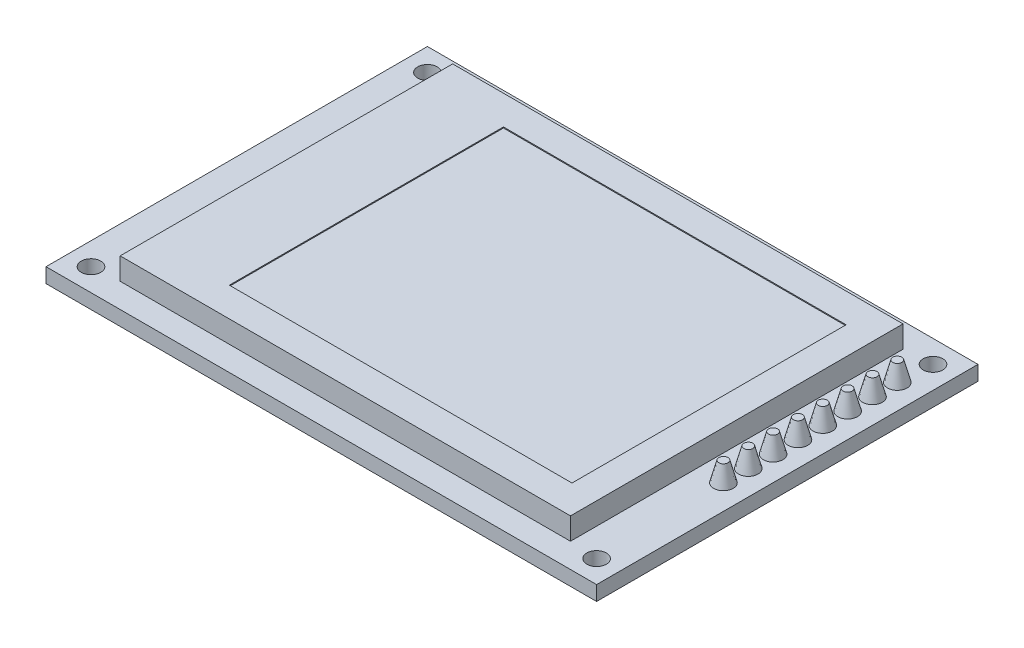
ISO-10303-21;
HEADER;
FILE_DESCRIPTION(('STEP AP214'),'2;1');
FILE_NAME('part.step','',(''),(''),'','','');
FILE_SCHEMA(('AUTOMOTIVE_DESIGN { 1 0 10303 214 1 1 1 1 }'));
ENDSEC;
DATA;
#1=APPLICATION_CONTEXT('core data for automotive mechanical design processes');
#2=APPLICATION_PROTOCOL_DEFINITION('international standard','automotive_design',2000,#1);
#3=PRODUCT_CONTEXT('',#1,'mechanical');
#4=PRODUCT('Part','Part','',(#3));
#5=PRODUCT_RELATED_PRODUCT_CATEGORY('part','',(#4));
#6=PRODUCT_DEFINITION_FORMATION('','',#4);
#7=PRODUCT_DEFINITION_CONTEXT('part definition',#1,'design');
#8=PRODUCT_DEFINITION('design','',#6,#7);
#9=PRODUCT_DEFINITION_SHAPE('','',#8);
#10=(LENGTH_UNIT() NAMED_UNIT(*) SI_UNIT(.MILLI.,.METRE.));
#11=(NAMED_UNIT(*) PLANE_ANGLE_UNIT() SI_UNIT($,.RADIAN.));
#12=(NAMED_UNIT(*) SI_UNIT($,.STERADIAN.) SOLID_ANGLE_UNIT());
#13=UNCERTAINTY_MEASURE_WITH_UNIT(LENGTH_MEASURE(1.E-05),#10,'distance_accuracy_value','');
#14=(GEOMETRIC_REPRESENTATION_CONTEXT(3) GLOBAL_UNCERTAINTY_ASSIGNED_CONTEXT((#13)) GLOBAL_UNIT_ASSIGNED_CONTEXT((#10,
#11,#12)) REPRESENTATION_CONTEXT('',''));
#15=CARTESIAN_POINT('',(0.,0.,0.));
#16=DIRECTION('',(0.,0.,1.));
#17=DIRECTION('',(1.,0.,0.));
#18=AXIS2_PLACEMENT_3D('',#15,#16,#17);
#19=CARTESIAN_POINT('',(0.,1.5,0.));
#20=DIRECTION('',(0.,1.,0.));
#21=DIRECTION('',(0.,0.,1.));
#22=AXIS2_PLACEMENT_3D('',#19,#20,#21);
#23=PLANE('',#22);
#24=CARTESIAN_POINT('',(22.9900000000002,1.5,5.51999999999999));
#25=DIRECTION('',(0.,1.,0.));
#26=DIRECTION('',(0.,0.,1.));
#27=AXIS2_PLACEMENT_3D('',#24,#25,#26);
#28=CIRCLE('',#27,1.);
#29=CARTESIAN_POINT('',(22.9900000000002,1.5,6.52));
#30=VERTEX_POINT('',#29);
#31=EDGE_CURVE('E416',#30,#30,#28,.T.);
#32=ORIENTED_EDGE('',*,*,#31,.F.);
#33=EDGE_LOOP('',(#32));
#34=FACE_BOUND('',#33,.T.);
#35=CARTESIAN_POINT('',(22.9900000000002,1.5,2.97999999999999));
#36=DIRECTION('',(0.,1.,0.));
#37=DIRECTION('',(0.,0.,1.));
#38=AXIS2_PLACEMENT_3D('',#35,#36,#37);
#39=CIRCLE('',#38,1.);
#40=CARTESIAN_POINT('',(22.9900000000002,1.5,3.97999999999999));
#41=VERTEX_POINT('',#40);
#42=EDGE_CURVE('E415',#41,#41,#39,.T.);
#43=ORIENTED_EDGE('',*,*,#42,.F.);
#44=EDGE_LOOP('',(#43));
#45=FACE_BOUND('',#44,.T.);
#46=CARTESIAN_POINT('',(22.9900000000001,1.5,0.439999999999994));
#47=DIRECTION('',(0.,1.,0.));
#48=DIRECTION('',(0.,0.,1.));
#49=AXIS2_PLACEMENT_3D('',#46,#47,#48);
#50=CIRCLE('',#49,1.);
#51=CARTESIAN_POINT('',(22.9900000000001,1.5,1.44));
#52=VERTEX_POINT('',#51);
#53=EDGE_CURVE('E426',#52,#52,#50,.T.);
#54=ORIENTED_EDGE('',*,*,#53,.F.);
#55=EDGE_LOOP('',(#54));
#56=FACE_BOUND('',#55,.T.);
#57=CARTESIAN_POINT('',(22.9900000000001,1.5,-2.10000000000001));
#58=DIRECTION('',(0.,1.,0.));
#59=DIRECTION('',(0.,0.,1.));
#60=AXIS2_PLACEMENT_3D('',#57,#58,#59);
#61=CIRCLE('',#60,1.);
#62=CARTESIAN_POINT('',(22.9900000000001,1.5,-1.1));
#63=VERTEX_POINT('',#62);
#64=EDGE_CURVE('E432',#63,#63,#61,.T.);
#65=ORIENTED_EDGE('',*,*,#64,.F.);
#66=EDGE_LOOP('',(#65));
#67=FACE_BOUND('',#66,.T.);
#68=CARTESIAN_POINT('',(22.9900000000001,1.5,-4.64000000000001));
#69=DIRECTION('',(0.,1.,0.));
#70=DIRECTION('',(0.,0.,1.));
#71=AXIS2_PLACEMENT_3D('',#68,#69,#70);
#72=CIRCLE('',#71,1.);
#73=CARTESIAN_POINT('',(22.9900000000001,1.5,-3.64000000000001));
#74=VERTEX_POINT('',#73);
#75=EDGE_CURVE('E438',#74,#74,#72,.T.);
#76=ORIENTED_EDGE('',*,*,#75,.F.);
#77=EDGE_LOOP('',(#76));
#78=FACE_BOUND('',#77,.T.);
#79=CARTESIAN_POINT('',(22.99,1.5,-7.18000000000001));
#80=DIRECTION('',(0.,1.,0.));
#81=DIRECTION('',(0.,0.,1.));
#82=AXIS2_PLACEMENT_3D('',#79,#80,#81);
#83=CIRCLE('',#82,1.);
#84=CARTESIAN_POINT('',(22.99,1.5,-6.18000000000001));
#85=VERTEX_POINT('',#84);
#86=EDGE_CURVE('E444',#85,#85,#83,.T.);
#87=ORIENTED_EDGE('',*,*,#86,.F.);
#88=EDGE_LOOP('',(#87));
#89=FACE_BOUND('',#88,.T.);
#90=CARTESIAN_POINT('',(22.99,1.5,-9.72000000000001));
#91=DIRECTION('',(0.,1.,0.));
#92=DIRECTION('',(0.,0.,1.));
#93=AXIS2_PLACEMENT_3D('',#90,#91,#92);
#94=CIRCLE('',#93,1.);
#95=CARTESIAN_POINT('',(22.99,1.5,-8.72000000000001));
#96=VERTEX_POINT('',#95);
#97=EDGE_CURVE('E450',#96,#96,#94,.T.);
#98=ORIENTED_EDGE('',*,*,#97,.F.);
#99=EDGE_LOOP('',(#98));
#100=FACE_BOUND('',#99,.T.);
#101=CARTESIAN_POINT('',(22.99,1.5,-12.26));
#102=DIRECTION('',(0.,1.,0.));
#103=DIRECTION('',(0.,0.,1.));
#104=AXIS2_PLACEMENT_3D('',#101,#102,#103);
#105=CIRCLE('',#104,1.);
#106=CARTESIAN_POINT('',(22.99,1.5,-11.26));
#107=VERTEX_POINT('',#106);
#108=EDGE_CURVE('E455',#107,#107,#105,.T.);
#109=ORIENTED_EDGE('',*,*,#108,.F.);
#110=EDGE_LOOP('',(#109));
#111=FACE_BOUND('',#110,.T.);
#112=CARTESIAN_POINT('',(-28.48,1.5,18.72));
#113=DIRECTION('',(0.,1.,0.));
#114=DIRECTION('',(0.,0.,1.));
#115=AXIS2_PLACEMENT_3D('',#112,#113,#114);
#116=CIRCLE('',#115,0.999999999999998);
#117=CARTESIAN_POINT('',(-28.48,1.5,19.72));
#118=VERTEX_POINT('',#117);
#119=EDGE_CURVE('E201',#118,#118,#116,.T.);
#120=ORIENTED_EDGE('',*,*,#119,.F.);
#121=EDGE_LOOP('',(#120));
#122=FACE_BOUND('',#121,.T.);
#123=CARTESIAN_POINT('',(-28.48,1.5,-15.68));
#124=DIRECTION('',(0.,1.,0.));
#125=DIRECTION('',(0.,0.,1.));
#126=AXIS2_PLACEMENT_3D('',#123,#124,#125);
#127=CIRCLE('',#126,0.999999999999998);
#128=CARTESIAN_POINT('',(-28.48,1.5,-14.68));
#129=VERTEX_POINT('',#128);
#130=EDGE_CURVE('E213',#129,#129,#127,.T.);
#131=ORIENTED_EDGE('',*,*,#130,.F.);
#132=EDGE_LOOP('',(#131));
#133=FACE_BOUND('',#132,.T.);
#134=DIRECTION('',(0.,0.,1.));
#135=VECTOR('',#134,1.);
#136=CARTESIAN_POINT('',(-30.78,1.5,-17.98));
#137=LINE('',#136,#135);
#138=CARTESIAN_POINT('',(-30.78,1.5,-17.98));
#139=VERTEX_POINT('',#138);
#140=CARTESIAN_POINT('',(-30.78,1.5,21.02));
#141=VERTEX_POINT('',#140);
#142=EDGE_CURVE('E219',#139,#141,#137,.T.);
#143=ORIENTED_EDGE('',*,*,#142,.T.);
#144=DIRECTION('',(1.,0.,0.));
#145=VECTOR('',#144,1.);
#146=CARTESIAN_POINT('',(-30.78,1.5,21.02));
#147=LINE('',#146,#145);
#148=CARTESIAN_POINT('',(25.52,1.5,21.02));
#149=VERTEX_POINT('',#148);
#150=EDGE_CURVE('E222',#141,#149,#147,.T.);
#151=ORIENTED_EDGE('',*,*,#150,.T.);
#152=DIRECTION('',(0.,0.,-1.));
#153=VECTOR('',#152,1.);
#154=CARTESIAN_POINT('',(25.52,1.5,-17.98));
#155=LINE('',#154,#153);
#156=CARTESIAN_POINT('',(25.52,1.5,-17.98));
#157=VERTEX_POINT('',#156);
#158=EDGE_CURVE('E225',#149,#157,#155,.T.);
#159=ORIENTED_EDGE('',*,*,#158,.T.);
#160=DIRECTION('',(-1.,0.,0.));
#161=VECTOR('',#160,1.);
#162=CARTESIAN_POINT('',(-30.78,1.5,-17.98));
#163=LINE('',#162,#161);
#164=EDGE_CURVE('E227',#157,#139,#163,.T.);
#165=ORIENTED_EDGE('',*,*,#164,.T.);
#166=EDGE_LOOP('',(#143,#151,#159,#165));
#167=FACE_BOUND('',#166,.T.);
#168=CARTESIAN_POINT('',(23.22,1.5,-15.68));
#169=DIRECTION('',(0.,1.,0.));
#170=DIRECTION('',(0.,0.,1.));
#171=AXIS2_PLACEMENT_3D('',#168,#169,#170);
#172=CIRCLE('',#171,0.999999999999998);
#173=CARTESIAN_POINT('',(23.22,1.5,-14.68));
#174=VERTEX_POINT('',#173);
#175=EDGE_CURVE('E207',#174,#174,#172,.T.);
#176=ORIENTED_EDGE('',*,*,#175,.F.);
#177=EDGE_LOOP('',(#176));
#178=FACE_BOUND('',#177,.T.);
#179=CARTESIAN_POINT('',(23.22,1.5,18.72));
#180=DIRECTION('',(0.,1.,0.));
#181=DIRECTION('',(0.,0.,1.));
#182=AXIS2_PLACEMENT_3D('',#179,#180,#181);
#183=CIRCLE('',#182,0.999999999999998);
#184=CARTESIAN_POINT('',(23.22,1.5,19.72));
#185=VERTEX_POINT('',#184);
#186=EDGE_CURVE('E195',#185,#185,#183,.T.);
#187=ORIENTED_EDGE('',*,*,#186,.F.);
#188=EDGE_LOOP('',(#187));
#189=FACE_BOUND('',#188,.T.);
#190=DIRECTION('',(1.,0.,0.));
#191=VECTOR('',#190,1.);
#192=CARTESIAN_POINT('',(-25.6979708439893,1.5,18.52));
#193=LINE('',#192,#191);
#194=CARTESIAN_POINT('',(-25.6979708439893,1.5,18.52));
#195=VERTEX_POINT('',#194);
#196=CARTESIAN_POINT('',(20.35,1.5,18.52));
#197=VERTEX_POINT('',#196);
#198=EDGE_CURVE('E181',#195,#197,#193,.T.);
#199=ORIENTED_EDGE('',*,*,#198,.F.);
#200=DIRECTION('',(0.,0.,1.));
#201=VECTOR('',#200,1.);
#202=CARTESIAN_POINT('',(-25.6979708439893,1.5,18.52));
#203=LINE('',#202,#201);
#204=CARTESIAN_POINT('',(-25.6979708439893,1.5,-15.48));
#205=VERTEX_POINT('',#204);
#206=EDGE_CURVE('E164',#205,#195,#203,.T.);
#207=ORIENTED_EDGE('',*,*,#206,.F.);
#208=DIRECTION('',(-1.,0.,0.));
#209=VECTOR('',#208,1.);
#210=CARTESIAN_POINT('',(20.35,1.5,-15.48));
#211=LINE('',#210,#209);
#212=CARTESIAN_POINT('',(20.35,1.5,-15.48));
#213=VERTEX_POINT('',#212);
#214=EDGE_CURVE('E172',#213,#205,#211,.T.);
#215=ORIENTED_EDGE('',*,*,#214,.F.);
#216=DIRECTION('',(0.,0.,-1.));
#217=VECTOR('',#216,1.);
#218=CARTESIAN_POINT('',(20.35,1.5,18.52));
#219=LINE('',#218,#217);
#220=EDGE_CURVE('E183',#197,#213,#219,.T.);
#221=ORIENTED_EDGE('',*,*,#220,.F.);
#222=EDGE_LOOP('',(#199,#207,#215,#221));
#223=FACE_BOUND('',#222,.T.);
#224=ADVANCED_FACE('F36',(#34,#45,#56,#67,#78,#89,#100,#111,#122,#133,#167,#178,#189,#223),#23,.T.);
#225=CARTESIAN_POINT('',(0.,0.,0.));
#226=DIRECTION('',(0.,1.,0.));
#227=DIRECTION('',(0.,0.,1.));
#228=AXIS2_PLACEMENT_3D('',#225,#226,#227);
#229=PLANE('',#228);
#230=DIRECTION('',(0.,0.,1.));
#231=VECTOR('',#230,1.);
#232=CARTESIAN_POINT('',(-30.78,0.,-17.98));
#233=LINE('',#232,#231);
#234=CARTESIAN_POINT('',(-30.78,0.,-17.98));
#235=VERTEX_POINT('',#234);
#236=CARTESIAN_POINT('',(-30.78,0.,21.02));
#237=VERTEX_POINT('',#236);
#238=EDGE_CURVE('E216',#235,#237,#233,.T.);
#239=ORIENTED_EDGE('',*,*,#238,.F.);
#240=DIRECTION('',(-1.,0.,0.));
#241=VECTOR('',#240,1.);
#242=CARTESIAN_POINT('',(-30.78,0.,-17.98));
#243=LINE('',#242,#241);
#244=CARTESIAN_POINT('',(25.52,0.,-17.98));
#245=VERTEX_POINT('',#244);
#246=EDGE_CURVE('E223',#245,#235,#243,.T.);
#247=ORIENTED_EDGE('',*,*,#246,.F.);
#248=DIRECTION('',(0.,0.,-1.));
#249=VECTOR('',#248,1.);
#250=CARTESIAN_POINT('',(25.52,0.,-17.98));
#251=LINE('',#250,#249);
#252=CARTESIAN_POINT('',(25.52,0.,21.02));
#253=VERTEX_POINT('',#252);
#254=EDGE_CURVE('E234',#253,#245,#251,.T.);
#255=ORIENTED_EDGE('',*,*,#254,.F.);
#256=DIRECTION('',(1.,0.,0.));
#257=VECTOR('',#256,1.);
#258=CARTESIAN_POINT('',(-30.78,0.,21.02));
#259=LINE('',#258,#257);
#260=EDGE_CURVE('E232',#237,#253,#259,.T.);
#261=ORIENTED_EDGE('',*,*,#260,.F.);
#262=EDGE_LOOP('',(#239,#247,#255,#261));
#263=FACE_BOUND('',#262,.T.);
#264=CARTESIAN_POINT('',(-28.48,0.,-15.68));
#265=DIRECTION('',(0.,1.,0.));
#266=DIRECTION('',(0.,0.,1.));
#267=AXIS2_PLACEMENT_3D('',#264,#265,#266);
#268=CIRCLE('',#267,0.999999999999998);
#269=CARTESIAN_POINT('',(-28.48,0.,-14.68));
#270=VERTEX_POINT('',#269);
#271=EDGE_CURVE('E210',#270,#270,#268,.T.);
#272=ORIENTED_EDGE('',*,*,#271,.T.);
#273=EDGE_LOOP('',(#272));
#274=FACE_BOUND('',#273,.T.);
#275=CARTESIAN_POINT('',(23.22,0.,-15.68));
#276=DIRECTION('',(0.,1.,0.));
#277=DIRECTION('',(0.,0.,1.));
#278=AXIS2_PLACEMENT_3D('',#275,#276,#277);
#279=CIRCLE('',#278,0.999999999999998);
#280=CARTESIAN_POINT('',(23.22,0.,-14.68));
#281=VERTEX_POINT('',#280);
#282=EDGE_CURVE('E204',#281,#281,#279,.T.);
#283=ORIENTED_EDGE('',*,*,#282,.T.);
#284=EDGE_LOOP('',(#283));
#285=FACE_BOUND('',#284,.T.);
#286=CARTESIAN_POINT('',(-28.48,0.,18.72));
#287=DIRECTION('',(0.,1.,0.));
#288=DIRECTION('',(0.,0.,1.));
#289=AXIS2_PLACEMENT_3D('',#286,#287,#288);
#290=CIRCLE('',#289,0.999999999999998);
#291=CARTESIAN_POINT('',(-28.48,0.,19.72));
#292=VERTEX_POINT('',#291);
#293=EDGE_CURVE('E198',#292,#292,#290,.T.);
#294=ORIENTED_EDGE('',*,*,#293,.T.);
#295=EDGE_LOOP('',(#294));
#296=FACE_BOUND('',#295,.T.);
#297=CARTESIAN_POINT('',(23.22,0.,18.72));
#298=DIRECTION('',(0.,1.,0.));
#299=DIRECTION('',(0.,0.,1.));
#300=AXIS2_PLACEMENT_3D('',#297,#298,#299);
#301=CIRCLE('',#300,0.999999999999998);
#302=CARTESIAN_POINT('',(23.22,0.,19.72));
#303=VERTEX_POINT('',#302);
#304=EDGE_CURVE('E194',#303,#303,#301,.T.);
#305=ORIENTED_EDGE('',*,*,#304,.T.);
#306=EDGE_LOOP('',(#305));
#307=FACE_BOUND('',#306,.T.);
#308=ADVANCED_FACE('F252',(#263,#274,#285,#296,#307),#229,.F.);
#309=CARTESIAN_POINT('',(-30.78,1.5,-17.98));
#310=DIRECTION('',(1.,0.,0.));
#311=DIRECTION('',(0.,0.,-1.));
#312=AXIS2_PLACEMENT_3D('',#309,#310,#311);
#313=PLANE('',#312);
#314=ORIENTED_EDGE('',*,*,#238,.T.);
#315=DIRECTION('',(0.,-1.,0.));
#316=VECTOR('',#315,1.);
#317=CARTESIAN_POINT('',(-30.78,1.5,21.02));
#318=LINE('',#317,#316);
#319=EDGE_CURVE('E11',#141,#237,#318,.T.);
#320=ORIENTED_EDGE('',*,*,#319,.F.);
#321=ORIENTED_EDGE('',*,*,#142,.F.);
#322=DIRECTION('',(0.,-1.,0.));
#323=VECTOR('',#322,1.);
#324=CARTESIAN_POINT('',(-30.78,1.5,-17.98));
#325=LINE('',#324,#323);
#326=EDGE_CURVE('E229',#139,#235,#325,.T.);
#327=ORIENTED_EDGE('',*,*,#326,.T.);
#328=EDGE_LOOP('',(#314,#320,#321,#327));
#329=FACE_BOUND('',#328,.T.);
#330=ADVANCED_FACE('F38',(#329),#313,.F.);
#331=CARTESIAN_POINT('',(-30.78,1.5,21.02));
#332=DIRECTION('',(0.,0.,-1.));
#333=DIRECTION('',(-1.,0.,0.));
#334=AXIS2_PLACEMENT_3D('',#331,#332,#333);
#335=PLANE('',#334);
#336=ORIENTED_EDGE('',*,*,#260,.T.);
#337=DIRECTION('',(0.,-1.,0.));
#338=VECTOR('',#337,1.);
#339=CARTESIAN_POINT('',(25.52,1.5,21.02));
#340=LINE('',#339,#338);
#341=EDGE_CURVE('E44',#149,#253,#340,.T.);
#342=ORIENTED_EDGE('',*,*,#341,.F.);
#343=ORIENTED_EDGE('',*,*,#150,.F.);
#344=ORIENTED_EDGE('',*,*,#319,.T.);
#345=EDGE_LOOP('',(#336,#342,#343,#344));
#346=FACE_BOUND('',#345,.T.);
#347=ADVANCED_FACE('F263',(#346),#335,.F.);
#348=CARTESIAN_POINT('',(25.52,1.5,-17.98));
#349=DIRECTION('',(-1.,0.,0.));
#350=DIRECTION('',(0.,0.,1.));
#351=AXIS2_PLACEMENT_3D('',#348,#349,#350);
#352=PLANE('',#351);
#353=ORIENTED_EDGE('',*,*,#254,.T.);
#354=DIRECTION('',(0.,-1.,0.));
#355=VECTOR('',#354,1.);
#356=CARTESIAN_POINT('',(25.52,1.5,-17.98));
#357=LINE('',#356,#355);
#358=EDGE_CURVE('E239',#157,#245,#357,.T.);
#359=ORIENTED_EDGE('',*,*,#358,.F.);
#360=ORIENTED_EDGE('',*,*,#158,.F.);
#361=ORIENTED_EDGE('',*,*,#341,.T.);
#362=EDGE_LOOP('',(#353,#359,#360,#361));
#363=FACE_BOUND('',#362,.T.);
#364=ADVANCED_FACE('F246',(#363),#352,.F.);
#365=CARTESIAN_POINT('',(-30.78,1.5,-17.98));
#366=DIRECTION('',(0.,0.,1.));
#367=DIRECTION('',(1.,0.,0.));
#368=AXIS2_PLACEMENT_3D('',#365,#366,#367);
#369=PLANE('',#368);
#370=ORIENTED_EDGE('',*,*,#246,.T.);
#371=ORIENTED_EDGE('',*,*,#326,.F.);
#372=ORIENTED_EDGE('',*,*,#164,.F.);
#373=ORIENTED_EDGE('',*,*,#358,.T.);
#374=EDGE_LOOP('',(#370,#371,#372,#373));
#375=FACE_BOUND('',#374,.T.);
#376=ADVANCED_FACE('F256',(#375),#369,.F.);
#377=CARTESIAN_POINT('',(-28.48,1.5,-15.68));
#378=DIRECTION('',(0.,-1.,0.));
#379=DIRECTION('',(0.,0.,-1.));
#380=AXIS2_PLACEMENT_3D('',#377,#378,#379);
#381=CYLINDRICAL_SURFACE('',#380,0.999999999999998);
#382=ORIENTED_EDGE('',*,*,#130,.T.);
#383=EDGE_LOOP('',(#382));
#384=FACE_BOUND('',#383,.T.);
#385=ORIENTED_EDGE('',*,*,#271,.F.);
#386=EDGE_LOOP('',(#385));
#387=FACE_BOUND('',#386,.T.);
#388=ADVANCED_FACE('F280',(#384,#387),#381,.F.);
#389=CARTESIAN_POINT('',(23.22,1.5,-15.68));
#390=DIRECTION('',(0.,-1.,0.));
#391=DIRECTION('',(0.,0.,-1.));
#392=AXIS2_PLACEMENT_3D('',#389,#390,#391);
#393=CYLINDRICAL_SURFACE('',#392,0.999999999999998);
#394=ORIENTED_EDGE('',*,*,#175,.T.);
#395=EDGE_LOOP('',(#394));
#396=FACE_BOUND('',#395,.T.);
#397=ORIENTED_EDGE('',*,*,#282,.F.);
#398=EDGE_LOOP('',(#397));
#399=FACE_BOUND('',#398,.T.);
#400=ADVANCED_FACE('F287',(#396,#399),#393,.F.);
#401=CARTESIAN_POINT('',(-28.48,1.5,18.72));
#402=DIRECTION('',(0.,-1.,0.));
#403=DIRECTION('',(0.,0.,-1.));
#404=AXIS2_PLACEMENT_3D('',#401,#402,#403);
#405=CYLINDRICAL_SURFACE('',#404,0.999999999999998);
#406=ORIENTED_EDGE('',*,*,#119,.T.);
#407=EDGE_LOOP('',(#406));
#408=FACE_BOUND('',#407,.T.);
#409=ORIENTED_EDGE('',*,*,#293,.F.);
#410=EDGE_LOOP('',(#409));
#411=FACE_BOUND('',#410,.T.);
#412=ADVANCED_FACE('F292',(#408,#411),#405,.F.);
#413=CARTESIAN_POINT('',(23.22,1.5,18.72));
#414=DIRECTION('',(0.,-1.,0.));
#415=DIRECTION('',(0.,0.,-1.));
#416=AXIS2_PLACEMENT_3D('',#413,#414,#415);
#417=CYLINDRICAL_SURFACE('',#416,0.999999999999998);
#418=ORIENTED_EDGE('',*,*,#186,.T.);
#419=EDGE_LOOP('',(#418));
#420=FACE_BOUND('',#419,.T.);
#421=ORIENTED_EDGE('',*,*,#304,.F.);
#422=EDGE_LOOP('',(#421));
#423=FACE_BOUND('',#422,.T.);
#424=ADVANCED_FACE('F304',(#420,#423),#417,.F.);
#425=CARTESIAN_POINT('',(-25.6979708439893,3.75,18.52));
#426=DIRECTION('',(1.,0.,0.));
#427=DIRECTION('',(0.,0.,-1.));
#428=AXIS2_PLACEMENT_3D('',#425,#426,#427);
#429=PLANE('',#428);
#430=ORIENTED_EDGE('',*,*,#206,.T.);
#431=DIRECTION('',(0.,-1.,0.));
#432=VECTOR('',#431,1.);
#433=CARTESIAN_POINT('',(-25.6979708439893,3.75,18.52));
#434=LINE('',#433,#432);
#435=CARTESIAN_POINT('',(-25.6979708439893,3.75,18.52));
#436=VERTEX_POINT('',#435);
#437=EDGE_CURVE('E192',#436,#195,#434,.T.);
#438=ORIENTED_EDGE('',*,*,#437,.F.);
#439=DIRECTION('',(0.,0.,1.));
#440=VECTOR('',#439,1.);
#441=CARTESIAN_POINT('',(-25.6979708439893,3.75,18.52));
#442=LINE('',#441,#440);
#443=CARTESIAN_POINT('',(-25.6979708439893,3.75,-15.48));
#444=VERTEX_POINT('',#443);
#445=EDGE_CURVE('E168',#444,#436,#442,.T.);
#446=ORIENTED_EDGE('',*,*,#445,.F.);
#447=DIRECTION('',(0.,-1.,0.));
#448=VECTOR('',#447,1.);
#449=CARTESIAN_POINT('',(-25.6979708439893,3.75,-15.48));
#450=LINE('',#449,#448);
#451=EDGE_CURVE('E178',#444,#205,#450,.T.);
#452=ORIENTED_EDGE('',*,*,#451,.T.);
#453=EDGE_LOOP('',(#430,#438,#446,#452));
#454=FACE_BOUND('',#453,.T.);
#455=ADVANCED_FACE('F306',(#454),#429,.F.);
#456=CARTESIAN_POINT('',(-25.6979708439893,3.75,18.52));
#457=DIRECTION('',(0.,0.,-1.));
#458=DIRECTION('',(-1.,0.,0.));
#459=AXIS2_PLACEMENT_3D('',#456,#457,#458);
#460=PLANE('',#459);
#461=ORIENTED_EDGE('',*,*,#198,.T.);
#462=DIRECTION('',(0.,-1.,0.));
#463=VECTOR('',#462,1.);
#464=CARTESIAN_POINT('',(20.35,3.75,18.52));
#465=LINE('',#464,#463);
#466=CARTESIAN_POINT('',(20.35,3.75,18.52));
#467=VERTEX_POINT('',#466);
#468=EDGE_CURVE('E189',#467,#197,#465,.T.);
#469=ORIENTED_EDGE('',*,*,#468,.F.);
#470=DIRECTION('',(1.,0.,0.));
#471=VECTOR('',#470,1.);
#472=CARTESIAN_POINT('',(-25.6979708439893,3.75,18.52));
#473=LINE('',#472,#471);
#474=EDGE_CURVE('E171',#436,#467,#473,.T.);
#475=ORIENTED_EDGE('',*,*,#474,.F.);
#476=ORIENTED_EDGE('',*,*,#437,.T.);
#477=EDGE_LOOP('',(#461,#469,#475,#476));
#478=FACE_BOUND('',#477,.T.);
#479=ADVANCED_FACE('F313',(#478),#460,.F.);
#480=CARTESIAN_POINT('',(20.35,3.75,18.52));
#481=DIRECTION('',(-1.,0.,0.));
#482=DIRECTION('',(0.,0.,1.));
#483=AXIS2_PLACEMENT_3D('',#480,#481,#482);
#484=PLANE('',#483);
#485=ORIENTED_EDGE('',*,*,#220,.T.);
#486=DIRECTION('',(0.,-1.,0.));
#487=VECTOR('',#486,1.);
#488=CARTESIAN_POINT('',(20.35,3.75,-15.48));
#489=LINE('',#488,#487);
#490=CARTESIAN_POINT('',(20.35,3.75,-15.48));
#491=VERTEX_POINT('',#490);
#492=EDGE_CURVE('E59',#491,#213,#489,.T.);
#493=ORIENTED_EDGE('',*,*,#492,.F.);
#494=DIRECTION('',(0.,0.,-1.));
#495=VECTOR('',#494,1.);
#496=CARTESIAN_POINT('',(20.35,3.75,18.52));
#497=LINE('',#496,#495);
#498=EDGE_CURVE('E174',#467,#491,#497,.T.);
#499=ORIENTED_EDGE('',*,*,#498,.F.);
#500=ORIENTED_EDGE('',*,*,#468,.T.);
#501=EDGE_LOOP('',(#485,#493,#499,#500));
#502=FACE_BOUND('',#501,.T.);
#503=ADVANCED_FACE('F321',(#502),#484,.F.);
#504=CARTESIAN_POINT('',(20.35,3.75,-15.48));
#505=DIRECTION('',(0.,0.,1.));
#506=DIRECTION('',(1.,0.,0.));
#507=AXIS2_PLACEMENT_3D('',#504,#505,#506);
#508=PLANE('',#507);
#509=ORIENTED_EDGE('',*,*,#214,.T.);
#510=ORIENTED_EDGE('',*,*,#451,.F.);
#511=DIRECTION('',(-1.,0.,0.));
#512=VECTOR('',#511,1.);
#513=CARTESIAN_POINT('',(20.35,3.75,-15.48));
#514=LINE('',#513,#512);
#515=EDGE_CURVE('E176',#491,#444,#514,.T.);
#516=ORIENTED_EDGE('',*,*,#515,.F.);
#517=ORIENTED_EDGE('',*,*,#492,.T.);
#518=EDGE_LOOP('',(#509,#510,#516,#517));
#519=FACE_BOUND('',#518,.T.);
#520=ADVANCED_FACE('F325',(#519),#508,.F.);
#521=CARTESIAN_POINT('',(0.,3.75,0.));
#522=DIRECTION('',(0.,1.,0.));
#523=DIRECTION('',(0.,0.,1.));
#524=AXIS2_PLACEMENT_3D('',#521,#522,#523);
#525=PLANE('',#524);
#526=DIRECTION('',(0.,0.,1.));
#527=VECTOR('',#526,1.);
#528=CARTESIAN_POINT('',(-17.52,3.75,-12.495));
#529=LINE('',#528,#527);
#530=CARTESIAN_POINT('',(-17.52,3.75,-12.495));
#531=VERTEX_POINT('',#530);
#532=CARTESIAN_POINT('',(-17.52,3.75,15.535));
#533=VERTEX_POINT('',#532);
#534=EDGE_CURVE('E51',#531,#533,#529,.T.);
#535=ORIENTED_EDGE('',*,*,#534,.F.);
#536=DIRECTION('',(-1.,0.,0.));
#537=VECTOR('',#536,1.);
#538=CARTESIAN_POINT('',(-17.52,3.75,-12.495));
#539=LINE('',#538,#537);
#540=CARTESIAN_POINT('',(17.52,3.75,-12.495));
#541=VERTEX_POINT('',#540);
#542=EDGE_CURVE('E146',#541,#531,#539,.T.);
#543=ORIENTED_EDGE('',*,*,#542,.F.);
#544=DIRECTION('',(0.,0.,-1.));
#545=VECTOR('',#544,1.);
#546=CARTESIAN_POINT('',(17.52,3.75,-12.495));
#547=LINE('',#546,#545);
#548=CARTESIAN_POINT('',(17.52,3.75,15.535));
#549=VERTEX_POINT('',#548);
#550=EDGE_CURVE('E149',#549,#541,#547,.T.);
#551=ORIENTED_EDGE('',*,*,#550,.F.);
#552=DIRECTION('',(1.,0.,0.));
#553=VECTOR('',#552,1.);
#554=CARTESIAN_POINT('',(-17.52,3.75,15.535));
#555=LINE('',#554,#553);
#556=EDGE_CURVE('E158',#533,#549,#555,.T.);
#557=ORIENTED_EDGE('',*,*,#556,.F.);
#558=EDGE_LOOP('',(#535,#543,#551,#557));
#559=FACE_BOUND('',#558,.T.);
#560=ORIENTED_EDGE('',*,*,#445,.T.);
#561=ORIENTED_EDGE('',*,*,#474,.T.);
#562=ORIENTED_EDGE('',*,*,#498,.T.);
#563=ORIENTED_EDGE('',*,*,#515,.T.);
#564=EDGE_LOOP('',(#560,#561,#562,#563));
#565=FACE_BOUND('',#564,.T.);
#566=ADVANCED_FACE('F329',(#559,#565),#525,.T.);
#567=CARTESIAN_POINT('',(-17.52,3.65,-12.495));
#568=DIRECTION('',(-1.,0.,0.));
#569=DIRECTION('',(0.,0.,1.));
#570=AXIS2_PLACEMENT_3D('',#567,#568,#569);
#571=PLANE('',#570);
#572=ORIENTED_EDGE('',*,*,#534,.T.);
#573=DIRECTION('',(0.,1.,0.));
#574=VECTOR('',#573,1.);
#575=CARTESIAN_POINT('',(-17.52,3.65,15.535));
#576=LINE('',#575,#574);
#577=CARTESIAN_POINT('',(-17.52,3.65,15.535));
#578=VERTEX_POINT('',#577);
#579=EDGE_CURVE('E124',#578,#533,#576,.T.);
#580=ORIENTED_EDGE('',*,*,#579,.F.);
#581=DIRECTION('',(0.,0.,1.));
#582=VECTOR('',#581,1.);
#583=CARTESIAN_POINT('',(-17.52,3.65,-12.495));
#584=LINE('',#583,#582);
#585=CARTESIAN_POINT('',(-17.52,3.65,-12.495));
#586=VERTEX_POINT('',#585);
#587=EDGE_CURVE('E128',#586,#578,#584,.T.);
#588=ORIENTED_EDGE('',*,*,#587,.F.);
#589=DIRECTION('',(0.,1.,0.));
#590=VECTOR('',#589,1.);
#591=CARTESIAN_POINT('',(-17.52,3.65,-12.495));
#592=LINE('',#591,#590);
#593=EDGE_CURVE('E162',#586,#531,#592,.T.);
#594=ORIENTED_EDGE('',*,*,#593,.T.);
#595=EDGE_LOOP('',(#572,#580,#588,#594));
#596=FACE_BOUND('',#595,.T.);
#597=ADVANCED_FACE('F126',(#596),#571,.F.);
#598=CARTESIAN_POINT('',(-17.52,3.65,-12.495));
#599=DIRECTION('',(0.,0.,-1.));
#600=DIRECTION('',(-1.,0.,0.));
#601=AXIS2_PLACEMENT_3D('',#598,#599,#600);
#602=PLANE('',#601);
#603=ORIENTED_EDGE('',*,*,#542,.T.);
#604=ORIENTED_EDGE('',*,*,#593,.F.);
#605=DIRECTION('',(-1.,0.,0.));
#606=VECTOR('',#605,1.);
#607=CARTESIAN_POINT('',(-17.52,3.65,-12.495));
#608=LINE('',#607,#606);
#609=CARTESIAN_POINT('',(17.52,3.65,-12.495));
#610=VERTEX_POINT('',#609);
#611=EDGE_CURVE('E134',#610,#586,#608,.T.);
#612=ORIENTED_EDGE('',*,*,#611,.F.);
#613=DIRECTION('',(0.,1.,0.));
#614=VECTOR('',#613,1.);
#615=CARTESIAN_POINT('',(17.52,3.65,-12.495));
#616=LINE('',#615,#614);
#617=EDGE_CURVE('E165',#610,#541,#616,.T.);
#618=ORIENTED_EDGE('',*,*,#617,.T.);
#619=EDGE_LOOP('',(#603,#604,#612,#618));
#620=FACE_BOUND('',#619,.T.);
#621=ADVANCED_FACE('F335',(#620),#602,.F.);
#622=CARTESIAN_POINT('',(17.52,3.65,-12.495));
#623=DIRECTION('',(1.,0.,0.));
#624=DIRECTION('',(0.,0.,-1.));
#625=AXIS2_PLACEMENT_3D('',#622,#623,#624);
#626=PLANE('',#625);
#627=ORIENTED_EDGE('',*,*,#550,.T.);
#628=ORIENTED_EDGE('',*,*,#617,.F.);
#629=DIRECTION('',(0.,0.,-1.));
#630=VECTOR('',#629,1.);
#631=CARTESIAN_POINT('',(17.52,3.65,-12.495));
#632=LINE('',#631,#630);
#633=CARTESIAN_POINT('',(17.52,3.65,15.535));
#634=VERTEX_POINT('',#633);
#635=EDGE_CURVE('E142',#634,#610,#632,.T.);
#636=ORIENTED_EDGE('',*,*,#635,.F.);
#637=DIRECTION('',(0.,1.,0.));
#638=VECTOR('',#637,1.);
#639=CARTESIAN_POINT('',(17.52,3.65,15.535));
#640=LINE('',#639,#638);
#641=EDGE_CURVE('E133',#634,#549,#640,.T.);
#642=ORIENTED_EDGE('',*,*,#641,.T.);
#643=EDGE_LOOP('',(#627,#628,#636,#642));
#644=FACE_BOUND('',#643,.T.);
#645=ADVANCED_FACE('F338',(#644),#626,.F.);
#646=CARTESIAN_POINT('',(-17.52,3.65,15.535));
#647=DIRECTION('',(0.,0.,1.));
#648=DIRECTION('',(1.,0.,0.));
#649=AXIS2_PLACEMENT_3D('',#646,#647,#648);
#650=PLANE('',#649);
#651=ORIENTED_EDGE('',*,*,#556,.T.);
#652=ORIENTED_EDGE('',*,*,#641,.F.);
#653=DIRECTION('',(1.,0.,0.));
#654=VECTOR('',#653,1.);
#655=CARTESIAN_POINT('',(-17.52,3.65,15.535));
#656=LINE('',#655,#654);
#657=EDGE_CURVE('E137',#578,#634,#656,.T.);
#658=ORIENTED_EDGE('',*,*,#657,.F.);
#659=ORIENTED_EDGE('',*,*,#579,.T.);
#660=EDGE_LOOP('',(#651,#652,#658,#659));
#661=FACE_BOUND('',#660,.T.);
#662=ADVANCED_FACE('F138',(#661),#650,.F.);
#663=CARTESIAN_POINT('',(0.,3.65,0.));
#664=DIRECTION('',(0.,1.,0.));
#665=DIRECTION('',(0.,0.,1.));
#666=AXIS2_PLACEMENT_3D('',#663,#664,#665);
#667=PLANE('',#666);
#668=ORIENTED_EDGE('',*,*,#587,.T.);
#669=ORIENTED_EDGE('',*,*,#657,.T.);
#670=ORIENTED_EDGE('',*,*,#635,.T.);
#671=ORIENTED_EDGE('',*,*,#611,.T.);
#672=EDGE_LOOP('',(#668,#669,#670,#671));
#673=FACE_BOUND('',#672,.T.);
#674=ADVANCED_FACE('F144',(#673),#667,.T.);
#675=CARTESIAN_POINT('',(22.99,1.5,-12.26));
#676=DIRECTION('',(0.,-1.,0.));
#677=DIRECTION('',(0.,0.,1.));
#678=AXIS2_PLACEMENT_3D('',#675,#676,#677);
#679=CONICAL_SURFACE('',#678,1.,0.261799387799149);
#680=CARTESIAN_POINT('',(22.99,3.5,-12.26));
#681=DIRECTION('',(0.,1.,0.));
#682=DIRECTION('',(0.,0.,1.));
#683=AXIS2_PLACEMENT_3D('',#680,#681,#682);
#684=CIRCLE('',#683,0.464101615137756);
#685=CARTESIAN_POINT('',(22.99,3.5,-11.7958983848622));
#686=VERTEX_POINT('',#685);
#687=EDGE_CURVE('E152',#686,#686,#684,.T.);
#688=ORIENTED_EDGE('',*,*,#687,.F.);
#689=EDGE_LOOP('',(#688));
#690=FACE_BOUND('',#689,.T.);
#691=ORIENTED_EDGE('',*,*,#108,.T.);
#692=EDGE_LOOP('',(#691));
#693=FACE_BOUND('',#692,.T.);
#694=ADVANCED_FACE('F347',(#690,#693),#679,.T.);
#695=CARTESIAN_POINT('',(22.99,3.5,-12.26));
#696=DIRECTION('',(0.,1.,0.));
#697=DIRECTION('',(0.,0.,1.));
#698=AXIS2_PLACEMENT_3D('',#695,#696,#697);
#699=PLANE('',#698);
#700=ORIENTED_EDGE('',*,*,#687,.T.);
#701=EDGE_LOOP('',(#700));
#702=FACE_BOUND('',#701,.T.);
#703=ADVANCED_FACE('F350',(#702),#699,.T.);
#704=CARTESIAN_POINT('',(22.99,1.5,-9.72000000000001));
#705=DIRECTION('',(0.,-1.,0.));
#706=DIRECTION('',(0.,0.,1.));
#707=AXIS2_PLACEMENT_3D('',#704,#705,#706);
#708=CONICAL_SURFACE('',#707,1.,0.261799387799149);
#709=CARTESIAN_POINT('',(22.99,3.5,-9.72000000000001));
#710=DIRECTION('',(0.,1.,0.));
#711=DIRECTION('',(0.,0.,1.));
#712=AXIS2_PLACEMENT_3D('',#709,#710,#711);
#713=CIRCLE('',#712,0.464101615137756);
#714=CARTESIAN_POINT('',(22.99,3.5,-9.25589838486225));
#715=VERTEX_POINT('',#714);
#716=EDGE_CURVE('E453',#715,#715,#713,.T.);
#717=ORIENTED_EDGE('',*,*,#716,.F.);
#718=EDGE_LOOP('',(#717));
#719=FACE_BOUND('',#718,.T.);
#720=ORIENTED_EDGE('',*,*,#97,.T.);
#721=EDGE_LOOP('',(#720));
#722=FACE_BOUND('',#721,.T.);
#723=ADVANCED_FACE('F354',(#719,#722),#708,.T.);
#724=CARTESIAN_POINT('',(22.99,3.5,-9.72000000000001));
#725=DIRECTION('',(0.,1.,0.));
#726=DIRECTION('',(0.,0.,1.));
#727=AXIS2_PLACEMENT_3D('',#724,#725,#726);
#728=PLANE('',#727);
#729=ORIENTED_EDGE('',*,*,#716,.T.);
#730=EDGE_LOOP('',(#729));
#731=FACE_BOUND('',#730,.T.);
#732=ADVANCED_FACE('F358',(#731),#728,.T.);
#733=CARTESIAN_POINT('',(22.99,1.5,-7.18000000000001));
#734=DIRECTION('',(0.,-1.,0.));
#735=DIRECTION('',(0.,0.,1.));
#736=AXIS2_PLACEMENT_3D('',#733,#734,#735);
#737=CONICAL_SURFACE('',#736,1.,0.261799387799149);
#738=CARTESIAN_POINT('',(22.99,3.5,-7.18000000000001));
#739=DIRECTION('',(0.,1.,0.));
#740=DIRECTION('',(0.,0.,1.));
#741=AXIS2_PLACEMENT_3D('',#738,#739,#740);
#742=CIRCLE('',#741,0.464101615137756);
#743=CARTESIAN_POINT('',(22.99,3.5,-6.71589838486225));
#744=VERTEX_POINT('',#743);
#745=EDGE_CURVE('E447',#744,#744,#742,.T.);
#746=ORIENTED_EDGE('',*,*,#745,.F.);
#747=EDGE_LOOP('',(#746));
#748=FACE_BOUND('',#747,.T.);
#749=ORIENTED_EDGE('',*,*,#86,.T.);
#750=EDGE_LOOP('',(#749));
#751=FACE_BOUND('',#750,.T.);
#752=ADVANCED_FACE('F362',(#748,#751),#737,.T.);
#753=CARTESIAN_POINT('',(22.99,3.5,-7.18000000000001));
#754=DIRECTION('',(0.,1.,0.));
#755=DIRECTION('',(0.,0.,1.));
#756=AXIS2_PLACEMENT_3D('',#753,#754,#755);
#757=PLANE('',#756);
#758=ORIENTED_EDGE('',*,*,#745,.T.);
#759=EDGE_LOOP('',(#758));
#760=FACE_BOUND('',#759,.T.);
#761=ADVANCED_FACE('F366',(#760),#757,.T.);
#762=CARTESIAN_POINT('',(22.9900000000001,1.5,-4.64000000000001));
#763=DIRECTION('',(0.,-1.,0.));
#764=DIRECTION('',(0.,0.,1.));
#765=AXIS2_PLACEMENT_3D('',#762,#763,#764);
#766=CONICAL_SURFACE('',#765,1.,0.261799387799149);
#767=CARTESIAN_POINT('',(22.9900000000001,3.5,-4.64000000000001));
#768=DIRECTION('',(0.,1.,0.));
#769=DIRECTION('',(0.,0.,1.));
#770=AXIS2_PLACEMENT_3D('',#767,#768,#769);
#771=CIRCLE('',#770,0.464101615137756);
#772=CARTESIAN_POINT('',(22.9900000000001,3.5,-4.17589838486225));
#773=VERTEX_POINT('',#772);
#774=EDGE_CURVE('E441',#773,#773,#771,.T.);
#775=ORIENTED_EDGE('',*,*,#774,.F.);
#776=EDGE_LOOP('',(#775));
#777=FACE_BOUND('',#776,.T.);
#778=ORIENTED_EDGE('',*,*,#75,.T.);
#779=EDGE_LOOP('',(#778));
#780=FACE_BOUND('',#779,.T.);
#781=ADVANCED_FACE('F370',(#777,#780),#766,.T.);
#782=CARTESIAN_POINT('',(22.9900000000001,3.5,-4.64000000000001));
#783=DIRECTION('',(0.,1.,0.));
#784=DIRECTION('',(0.,0.,1.));
#785=AXIS2_PLACEMENT_3D('',#782,#783,#784);
#786=PLANE('',#785);
#787=ORIENTED_EDGE('',*,*,#774,.T.);
#788=EDGE_LOOP('',(#787));
#789=FACE_BOUND('',#788,.T.);
#790=ADVANCED_FACE('F374',(#789),#786,.T.);
#791=CARTESIAN_POINT('',(22.9900000000001,1.5,-2.10000000000001));
#792=DIRECTION('',(0.,-1.,0.));
#793=DIRECTION('',(0.,0.,1.));
#794=AXIS2_PLACEMENT_3D('',#791,#792,#793);
#795=CONICAL_SURFACE('',#794,1.,0.261799387799149);
#796=CARTESIAN_POINT('',(22.9900000000001,3.5,-2.10000000000001));
#797=DIRECTION('',(0.,1.,0.));
#798=DIRECTION('',(0.,0.,1.));
#799=AXIS2_PLACEMENT_3D('',#796,#797,#798);
#800=CIRCLE('',#799,0.464101615137756);
#801=CARTESIAN_POINT('',(22.9900000000001,3.5,-1.63589838486225));
#802=VERTEX_POINT('',#801);
#803=EDGE_CURVE('E435',#802,#802,#800,.T.);
#804=ORIENTED_EDGE('',*,*,#803,.F.);
#805=EDGE_LOOP('',(#804));
#806=FACE_BOUND('',#805,.T.);
#807=ORIENTED_EDGE('',*,*,#64,.T.);
#808=EDGE_LOOP('',(#807));
#809=FACE_BOUND('',#808,.T.);
#810=ADVANCED_FACE('F378',(#806,#809),#795,.T.);
#811=CARTESIAN_POINT('',(22.9900000000001,3.5,-2.10000000000001));
#812=DIRECTION('',(0.,1.,0.));
#813=DIRECTION('',(0.,0.,1.));
#814=AXIS2_PLACEMENT_3D('',#811,#812,#813);
#815=PLANE('',#814);
#816=ORIENTED_EDGE('',*,*,#803,.T.);
#817=EDGE_LOOP('',(#816));
#818=FACE_BOUND('',#817,.T.);
#819=ADVANCED_FACE('F382',(#818),#815,.T.);
#820=CARTESIAN_POINT('',(22.9900000000001,1.5,0.439999999999994));
#821=DIRECTION('',(0.,-1.,0.));
#822=DIRECTION('',(0.,0.,1.));
#823=AXIS2_PLACEMENT_3D('',#820,#821,#822);
#824=CONICAL_SURFACE('',#823,1.,0.261799387799149);
#825=CARTESIAN_POINT('',(22.9900000000001,3.5,0.439999999999994));
#826=DIRECTION('',(0.,1.,0.));
#827=DIRECTION('',(0.,0.,1.));
#828=AXIS2_PLACEMENT_3D('',#825,#826,#827);
#829=CIRCLE('',#828,0.464101615137756);
#830=CARTESIAN_POINT('',(22.9900000000001,3.5,0.90410161513775));
#831=VERTEX_POINT('',#830);
#832=EDGE_CURVE('E429',#831,#831,#829,.T.);
#833=ORIENTED_EDGE('',*,*,#832,.F.);
#834=EDGE_LOOP('',(#833));
#835=FACE_BOUND('',#834,.T.);
#836=ORIENTED_EDGE('',*,*,#53,.T.);
#837=EDGE_LOOP('',(#836));
#838=FACE_BOUND('',#837,.T.);
#839=ADVANCED_FACE('F386',(#835,#838),#824,.T.);
#840=CARTESIAN_POINT('',(22.9900000000001,3.5,0.439999999999994));
#841=DIRECTION('',(0.,1.,0.));
#842=DIRECTION('',(0.,0.,1.));
#843=AXIS2_PLACEMENT_3D('',#840,#841,#842);
#844=PLANE('',#843);
#845=ORIENTED_EDGE('',*,*,#832,.T.);
#846=EDGE_LOOP('',(#845));
#847=FACE_BOUND('',#846,.T.);
#848=ADVANCED_FACE('F390',(#847),#844,.T.);
#849=CARTESIAN_POINT('',(22.9900000000002,1.5,2.97999999999999));
#850=DIRECTION('',(0.,-1.,0.));
#851=DIRECTION('',(0.,0.,1.));
#852=AXIS2_PLACEMENT_3D('',#849,#850,#851);
#853=CONICAL_SURFACE('',#852,1.,0.261799387799149);
#854=CARTESIAN_POINT('',(22.9900000000002,3.5,2.97999999999999));
#855=DIRECTION('',(0.,1.,0.));
#856=DIRECTION('',(0.,0.,1.));
#857=AXIS2_PLACEMENT_3D('',#854,#855,#856);
#858=CIRCLE('',#857,0.464101615137756);
#859=CARTESIAN_POINT('',(22.9900000000002,3.5,3.44410161513775));
#860=VERTEX_POINT('',#859);
#861=EDGE_CURVE('E419',#860,#860,#858,.T.);
#862=ORIENTED_EDGE('',*,*,#861,.F.);
#863=EDGE_LOOP('',(#862));
#864=FACE_BOUND('',#863,.T.);
#865=ORIENTED_EDGE('',*,*,#42,.T.);
#866=EDGE_LOOP('',(#865));
#867=FACE_BOUND('',#866,.T.);
#868=ADVANCED_FACE('F394',(#864,#867),#853,.T.);
#869=CARTESIAN_POINT('',(22.9900000000002,3.5,2.97999999999999));
#870=DIRECTION('',(0.,1.,0.));
#871=DIRECTION('',(0.,0.,1.));
#872=AXIS2_PLACEMENT_3D('',#869,#870,#871);
#873=PLANE('',#872);
#874=ORIENTED_EDGE('',*,*,#861,.T.);
#875=EDGE_LOOP('',(#874));
#876=FACE_BOUND('',#875,.T.);
#877=ADVANCED_FACE('F398',(#876),#873,.T.);
#878=CARTESIAN_POINT('',(22.9900000000002,1.5,5.51999999999999));
#879=DIRECTION('',(0.,-1.,0.));
#880=DIRECTION('',(0.,0.,1.));
#881=AXIS2_PLACEMENT_3D('',#878,#879,#880);
#882=CONICAL_SURFACE('',#881,1.,0.261799387799149);
#883=CARTESIAN_POINT('',(22.9900000000002,3.5,5.51999999999999));
#884=DIRECTION('',(0.,1.,0.));
#885=DIRECTION('',(0.,0.,1.));
#886=AXIS2_PLACEMENT_3D('',#883,#884,#885);
#887=CIRCLE('',#886,0.464101615137756);
#888=CARTESIAN_POINT('',(22.9900000000002,3.5,5.98410161513775));
#889=VERTEX_POINT('',#888);
#890=EDGE_CURVE('E414',#889,#889,#887,.T.);
#891=ORIENTED_EDGE('',*,*,#890,.F.);
#892=EDGE_LOOP('',(#891));
#893=FACE_BOUND('',#892,.T.);
#894=ORIENTED_EDGE('',*,*,#31,.T.);
#895=EDGE_LOOP('',(#894));
#896=FACE_BOUND('',#895,.T.);
#897=ADVANCED_FACE('F402',(#893,#896),#882,.T.);
#898=CARTESIAN_POINT('',(22.9900000000002,3.5,5.51999999999999));
#899=DIRECTION('',(0.,1.,0.));
#900=DIRECTION('',(0.,0.,1.));
#901=AXIS2_PLACEMENT_3D('',#898,#899,#900);
#902=PLANE('',#901);
#903=ORIENTED_EDGE('',*,*,#890,.T.);
#904=EDGE_LOOP('',(#903));
#905=FACE_BOUND('',#904,.T.);
#906=ADVANCED_FACE('F406',(#905),#902,.T.);
#907=CLOSED_SHELL('',(#224,#308,#330,#347,#364,#376,#388,#400,#412,#424,#455,#479,#503,#520,
#566,#597,#621,#645,#662,#674,#694,#703,#723,#732,#752,#761,#781,#790,#810,#819,#839,#848,#868,
#877,#897,#906));
#908=MANIFOLD_SOLID_BREP('B2',#907);
#909=ADVANCED_BREP_SHAPE_REPRESENTATION('',(#18,#908),#14);
#910=SHAPE_DEFINITION_REPRESENTATION(#9,#909);
ENDSEC;
END-ISO-10303-21;
